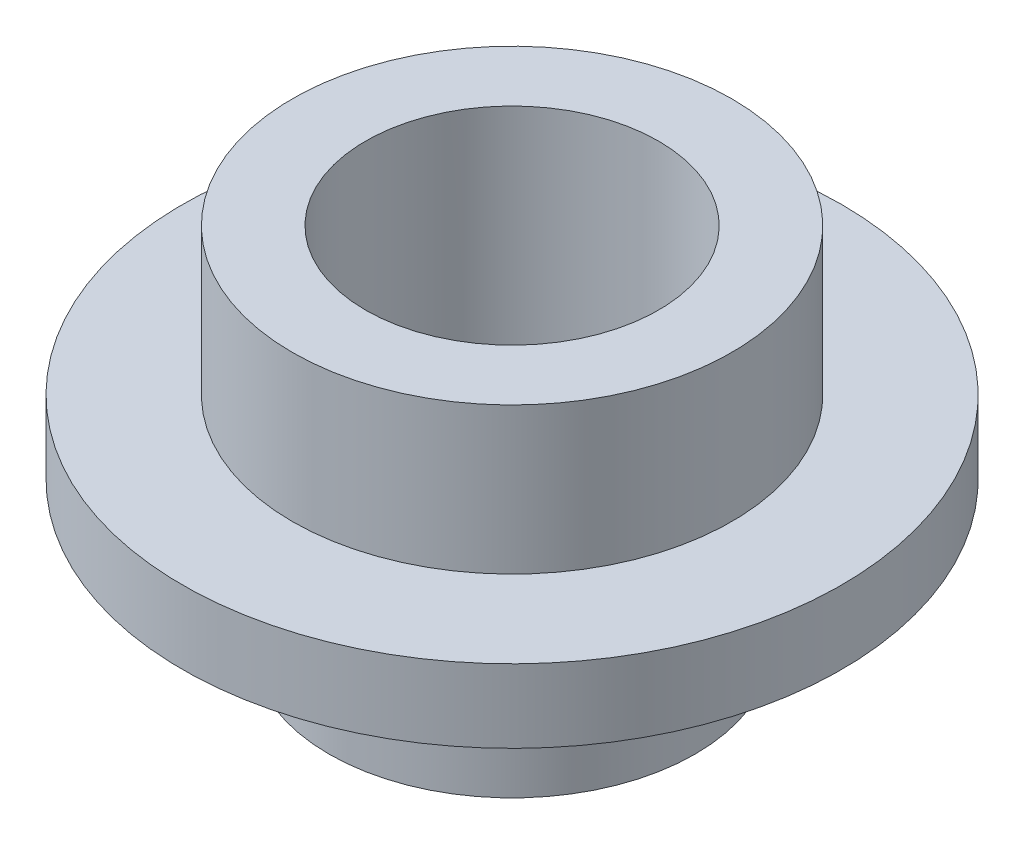
ISO-10303-21;
HEADER;
FILE_DESCRIPTION(('STEP AP214'),'2;1');
FILE_NAME('part.step','',(''),(''),'','','');
FILE_SCHEMA(('AUTOMOTIVE_DESIGN { 1 0 10303 214 1 1 1 1 }'));
ENDSEC;
DATA;
#1=APPLICATION_CONTEXT('core data for automotive mechanical design processes');
#2=APPLICATION_PROTOCOL_DEFINITION('international standard','automotive_design',2000,#1);
#3=PRODUCT_CONTEXT('',#1,'mechanical');
#4=PRODUCT('Part','Part','',(#3));
#5=PRODUCT_RELATED_PRODUCT_CATEGORY('part','',(#4));
#6=PRODUCT_DEFINITION_FORMATION('','',#4);
#7=PRODUCT_DEFINITION_CONTEXT('part definition',#1,'design');
#8=PRODUCT_DEFINITION('design','',#6,#7);
#9=PRODUCT_DEFINITION_SHAPE('','',#8);
#10=(LENGTH_UNIT() NAMED_UNIT(*) SI_UNIT(.MILLI.,.METRE.));
#11=(NAMED_UNIT(*) PLANE_ANGLE_UNIT() SI_UNIT($,.RADIAN.));
#12=(NAMED_UNIT(*) SI_UNIT($,.STERADIAN.) SOLID_ANGLE_UNIT());
#13=UNCERTAINTY_MEASURE_WITH_UNIT(LENGTH_MEASURE(1.E-05),#10,'distance_accuracy_value','');
#14=(GEOMETRIC_REPRESENTATION_CONTEXT(3) GLOBAL_UNCERTAINTY_ASSIGNED_CONTEXT((#13)) GLOBAL_UNIT_ASSIGNED_CONTEXT((#10,
#11,#12)) REPRESENTATION_CONTEXT('',''));
#15=CARTESIAN_POINT('',(0.,0.,0.));
#16=DIRECTION('',(0.,0.,1.));
#17=DIRECTION('',(1.,0.,0.));
#18=AXIS2_PLACEMENT_3D('',#15,#16,#17);
#19=CARTESIAN_POINT('',(0.,-6.35,0.));
#20=DIRECTION('',(0.,-1.,0.));
#21=DIRECTION('',(0.,0.,-1.));
#22=AXIS2_PLACEMENT_3D('',#19,#20,#21);
#23=PLANE('',#22);
#24=CARTESIAN_POINT('',(0.,-6.35,0.));
#25=DIRECTION('',(0.,-1.,0.));
#26=DIRECTION('',(0.,0.,-1.));
#27=AXIS2_PLACEMENT_3D('',#24,#25,#26);
#28=CIRCLE('',#27,28.575);
#29=CARTESIAN_POINT('',(0.,-6.35,-28.575));
#30=VERTEX_POINT('',#29);
#31=EDGE_CURVE('E48',#30,#30,#28,.T.);
#32=ORIENTED_EDGE('',*,*,#31,.T.);
#33=EDGE_LOOP('',(#32));
#34=FACE_BOUND('',#33,.T.);
#35=CARTESIAN_POINT('',(0.,-6.35,0.));
#36=DIRECTION('',(0.,-1.,0.));
#37=DIRECTION('',(0.,0.,-1.));
#38=AXIS2_PLACEMENT_3D('',#35,#36,#37);
#39=CIRCLE('',#38,15.875);
#40=CARTESIAN_POINT('',(0.,-6.35,-15.875));
#41=VERTEX_POINT('',#40);
#42=EDGE_CURVE('E52',#41,#41,#39,.T.);
#43=ORIENTED_EDGE('',*,*,#42,.F.);
#44=EDGE_LOOP('',(#43));
#45=FACE_BOUND('',#44,.T.);
#46=ADVANCED_FACE('F31',(#34,#45),#23,.T.);
#47=CARTESIAN_POINT('',(0.,12.7,0.));
#48=DIRECTION('',(0.,1.,0.));
#49=DIRECTION('',(0.,0.,1.));
#50=AXIS2_PLACEMENT_3D('',#47,#48,#49);
#51=PLANE('',#50);
#52=CARTESIAN_POINT('',(0.,12.7,0.));
#53=DIRECTION('',(0.,1.,0.));
#54=DIRECTION('',(0.,0.,1.));
#55=AXIS2_PLACEMENT_3D('',#52,#53,#54);
#56=CIRCLE('',#55,19.05);
#57=CARTESIAN_POINT('',(0.,12.7,19.05));
#58=VERTEX_POINT('',#57);
#59=EDGE_CURVE('E10',#58,#58,#56,.T.);
#60=ORIENTED_EDGE('',*,*,#59,.T.);
#61=EDGE_LOOP('',(#60));
#62=FACE_BOUND('',#61,.T.);
#63=CARTESIAN_POINT('',(0.,12.7,0.));
#64=DIRECTION('',(0.,1.,0.));
#65=DIRECTION('',(0.,0.,1.));
#66=AXIS2_PLACEMENT_3D('',#63,#64,#65);
#67=CIRCLE('',#66,12.7);
#68=CARTESIAN_POINT('',(0.,12.7,12.7));
#69=VERTEX_POINT('',#68);
#70=EDGE_CURVE('E39',#69,#69,#67,.T.);
#71=ORIENTED_EDGE('',*,*,#70,.F.);
#72=EDGE_LOOP('',(#71));
#73=FACE_BOUND('',#72,.T.);
#74=ADVANCED_FACE('F79',(#62,#73),#51,.T.);
#75=CARTESIAN_POINT('',(0.,12.7,0.));
#76=DIRECTION('',(0.,-1.,0.));
#77=DIRECTION('',(0.,0.,-1.));
#78=AXIS2_PLACEMENT_3D('',#75,#76,#77);
#79=CYLINDRICAL_SURFACE('',#78,19.05);
#80=ORIENTED_EDGE('',*,*,#59,.F.);
#81=EDGE_LOOP('',(#80));
#82=FACE_BOUND('',#81,.T.);
#83=CARTESIAN_POINT('',(0.,0.,0.));
#84=DIRECTION('',(0.,1.,0.));
#85=DIRECTION('',(0.,0.,1.));
#86=AXIS2_PLACEMENT_3D('',#83,#84,#85);
#87=CIRCLE('',#86,19.05);
#88=CARTESIAN_POINT('',(0.,0.,19.05));
#89=VERTEX_POINT('',#88);
#90=EDGE_CURVE('E35',#89,#89,#87,.T.);
#91=ORIENTED_EDGE('',*,*,#90,.T.);
#92=EDGE_LOOP('',(#91));
#93=FACE_BOUND('',#92,.T.);
#94=ADVANCED_FACE('F33',(#82,#93),#79,.T.);
#95=CARTESIAN_POINT('',(0.,12.7,0.));
#96=DIRECTION('',(0.,-1.,0.));
#97=DIRECTION('',(0.,0.,-1.));
#98=AXIS2_PLACEMENT_3D('',#95,#96,#97);
#99=CYLINDRICAL_SURFACE('',#98,12.7);
#100=ORIENTED_EDGE('',*,*,#70,.T.);
#101=EDGE_LOOP('',(#100));
#102=FACE_BOUND('',#101,.T.);
#103=CARTESIAN_POINT('',(0.,-19.05,0.));
#104=DIRECTION('',(0.,-1.,0.));
#105=DIRECTION('',(0.,0.,-1.));
#106=AXIS2_PLACEMENT_3D('',#103,#104,#105);
#107=CIRCLE('',#106,12.7);
#108=CARTESIAN_POINT('',(0.,-19.05,-12.7));
#109=VERTEX_POINT('',#108);
#110=EDGE_CURVE('E55',#109,#109,#107,.T.);
#111=ORIENTED_EDGE('',*,*,#110,.T.);
#112=EDGE_LOOP('',(#111));
#113=FACE_BOUND('',#112,.T.);
#114=ADVANCED_FACE('F61',(#102,#113),#99,.F.);
#115=CARTESIAN_POINT('',(0.,0.,0.));
#116=DIRECTION('',(0.,-1.,0.));
#117=DIRECTION('',(0.,0.,-1.));
#118=AXIS2_PLACEMENT_3D('',#115,#116,#117);
#119=PLANE('',#118);
#120=ORIENTED_EDGE('',*,*,#90,.F.);
#121=EDGE_LOOP('',(#120));
#122=FACE_BOUND('',#121,.T.);
#123=CARTESIAN_POINT('',(0.,0.,0.));
#124=DIRECTION('',(0.,-1.,0.));
#125=DIRECTION('',(0.,0.,-1.));
#126=AXIS2_PLACEMENT_3D('',#123,#124,#125);
#127=CIRCLE('',#126,28.575);
#128=CARTESIAN_POINT('',(0.,0.,-28.575));
#129=VERTEX_POINT('',#128);
#130=EDGE_CURVE('E45',#129,#129,#127,.T.);
#131=ORIENTED_EDGE('',*,*,#130,.F.);
#132=EDGE_LOOP('',(#131));
#133=FACE_BOUND('',#132,.T.);
#134=ADVANCED_FACE('F75',(#122,#133),#119,.F.);
#135=CARTESIAN_POINT('',(0.,-6.35,0.));
#136=DIRECTION('',(0.,1.,0.));
#137=DIRECTION('',(0.,0.,1.));
#138=AXIS2_PLACEMENT_3D('',#135,#136,#137);
#139=CYLINDRICAL_SURFACE('',#138,28.575);
#140=ORIENTED_EDGE('',*,*,#31,.F.);
#141=EDGE_LOOP('',(#140));
#142=FACE_BOUND('',#141,.T.);
#143=ORIENTED_EDGE('',*,*,#130,.T.);
#144=EDGE_LOOP('',(#143));
#145=FACE_BOUND('',#144,.T.);
#146=ADVANCED_FACE('F66',(#142,#145),#139,.T.);
#147=CARTESIAN_POINT('',(0.,-19.05,0.));
#148=DIRECTION('',(0.,-1.,0.));
#149=DIRECTION('',(0.,0.,-1.));
#150=AXIS2_PLACEMENT_3D('',#147,#148,#149);
#151=PLANE('',#150);
#152=CARTESIAN_POINT('',(0.,-19.05,0.));
#153=DIRECTION('',(0.,-1.,0.));
#154=DIRECTION('',(0.,0.,-1.));
#155=AXIS2_PLACEMENT_3D('',#152,#153,#154);
#156=CIRCLE('',#155,15.875);
#157=CARTESIAN_POINT('',(0.,-19.05,-15.875));
#158=VERTEX_POINT('',#157);
#159=EDGE_CURVE('E49',#158,#158,#156,.T.);
#160=ORIENTED_EDGE('',*,*,#159,.T.);
#161=EDGE_LOOP('',(#160));
#162=FACE_BOUND('',#161,.T.);
#163=ORIENTED_EDGE('',*,*,#110,.F.);
#164=EDGE_LOOP('',(#163));
#165=FACE_BOUND('',#164,.T.);
#166=ADVANCED_FACE('F63',(#162,#165),#151,.T.);
#167=CARTESIAN_POINT('',(0.,-19.05,0.));
#168=DIRECTION('',(0.,1.,0.));
#169=DIRECTION('',(0.,0.,1.));
#170=AXIS2_PLACEMENT_3D('',#167,#168,#169);
#171=CYLINDRICAL_SURFACE('',#170,15.875);
#172=ORIENTED_EDGE('',*,*,#159,.F.);
#173=EDGE_LOOP('',(#172));
#174=FACE_BOUND('',#173,.T.);
#175=ORIENTED_EDGE('',*,*,#42,.T.);
#176=EDGE_LOOP('',(#175));
#177=FACE_BOUND('',#176,.T.);
#178=ADVANCED_FACE('F65',(#174,#177),#171,.T.);
#179=CLOSED_SHELL('',(#46,#74,#94,#114,#134,#146,#166,#178));
#180=MANIFOLD_SOLID_BREP('B2',#179);
#181=ADVANCED_BREP_SHAPE_REPRESENTATION('',(#18,#180),#14);
#182=SHAPE_DEFINITION_REPRESENTATION(#9,#181);
ENDSEC;
END-ISO-10303-21;
